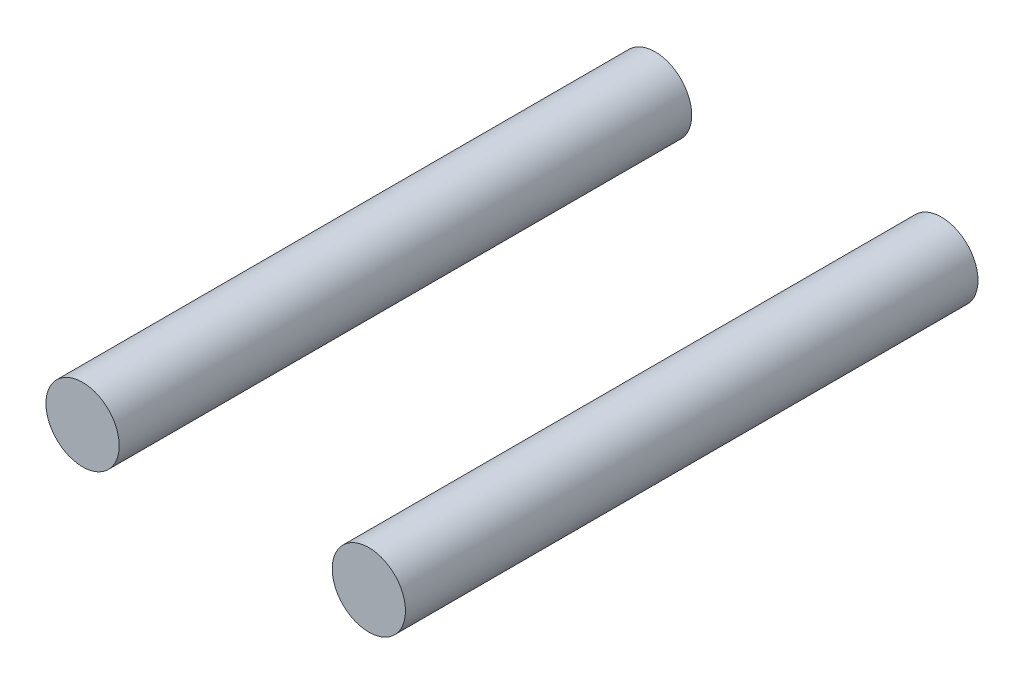
ISO-10303-21;
HEADER;
FILE_DESCRIPTION(('STEP AP214'),'2;1');
FILE_NAME('part.step','',(''),(''),'','','');
FILE_SCHEMA(('AUTOMOTIVE_DESIGN { 1 0 10303 214 1 1 1 1 }'));
ENDSEC;
DATA;
#1=APPLICATION_CONTEXT('core data for automotive mechanical design processes');
#2=APPLICATION_PROTOCOL_DEFINITION('international standard','automotive_design',2000,#1);
#3=PRODUCT_CONTEXT('',#1,'mechanical');
#4=PRODUCT('Part','Part','',(#3));
#5=PRODUCT_RELATED_PRODUCT_CATEGORY('part','',(#4));
#6=PRODUCT_DEFINITION_FORMATION('','',#4);
#7=PRODUCT_DEFINITION_CONTEXT('part definition',#1,'design');
#8=PRODUCT_DEFINITION('design','',#6,#7);
#9=PRODUCT_DEFINITION_SHAPE('','',#8);
#10=(LENGTH_UNIT() NAMED_UNIT(*) SI_UNIT(.MILLI.,.METRE.));
#11=(NAMED_UNIT(*) PLANE_ANGLE_UNIT() SI_UNIT($,.RADIAN.));
#12=(NAMED_UNIT(*) SI_UNIT($,.STERADIAN.) SOLID_ANGLE_UNIT());
#13=UNCERTAINTY_MEASURE_WITH_UNIT(LENGTH_MEASURE(1.E-05),#10,'distance_accuracy_value','');
#14=(GEOMETRIC_REPRESENTATION_CONTEXT(3) GLOBAL_UNCERTAINTY_ASSIGNED_CONTEXT((#13)) GLOBAL_UNIT_ASSIGNED_CONTEXT((#10,
#11,#12)) REPRESENTATION_CONTEXT('',''));
#15=CARTESIAN_POINT('',(0.,0.,0.));
#16=DIRECTION('',(0.,0.,1.));
#17=DIRECTION('',(1.,0.,0.));
#18=AXIS2_PLACEMENT_3D('',#15,#16,#17);
#19=CARTESIAN_POINT('',(1.25,0.,0.));
#20=DIRECTION('',(0.,0.,1.));
#21=DIRECTION('',(1.,0.,0.));
#22=AXIS2_PLACEMENT_3D('',#19,#20,#21);
#23=PLANE('',#22);
#24=CARTESIAN_POINT('',(1.25,0.,0.));
#25=DIRECTION('',(0.,0.,1.));
#26=DIRECTION('',(1.,0.,0.));
#27=AXIS2_PLACEMENT_3D('',#24,#25,#26);
#28=CIRCLE('',#27,0.32);
#29=CARTESIAN_POINT('',(1.57,0.,0.));
#30=VERTEX_POINT('',#29);
#31=EDGE_CURVE('P0_E18',#30,#30,#28,.F.);
#32=ORIENTED_EDGE('',*,*,#31,.F.);
#33=EDGE_LOOP('',(#32));
#34=FACE_BOUND('',#33,.T.);
#35=ADVANCED_FACE('P0_F15',(#34),#23,.T.);
#36=CARTESIAN_POINT('',(1.25,0.,-5.));
#37=DIRECTION('',(0.,0.,1.));
#38=DIRECTION('',(1.,0.,0.));
#39=AXIS2_PLACEMENT_3D('',#36,#37,#38);
#40=PLANE('',#39);
#41=CARTESIAN_POINT('',(1.25,0.,-5.));
#42=DIRECTION('',(0.,0.,1.));
#43=DIRECTION('',(1.,0.,0.));
#44=AXIS2_PLACEMENT_3D('',#41,#42,#43);
#45=CIRCLE('',#44,0.32);
#46=CARTESIAN_POINT('',(1.57,0.,-5.));
#47=VERTEX_POINT('',#46);
#48=EDGE_CURVE('P0_E10',#47,#47,#45,.T.);
#49=ORIENTED_EDGE('',*,*,#48,.F.);
#50=EDGE_LOOP('',(#49));
#51=FACE_BOUND('',#50,.T.);
#52=ADVANCED_FACE('P0_F30',(#51),#40,.F.);
#53=CARTESIAN_POINT('',(1.25,0.,-5.));
#54=DIRECTION('',(0.,0.,1.));
#55=DIRECTION('',(1.,0.,0.));
#56=AXIS2_PLACEMENT_3D('',#53,#54,#55);
#57=CYLINDRICAL_SURFACE('',#56,0.32);
#58=ORIENTED_EDGE('',*,*,#48,.T.);
#59=EDGE_LOOP('',(#58));
#60=FACE_BOUND('',#59,.T.);
#61=ORIENTED_EDGE('',*,*,#31,.T.);
#62=EDGE_LOOP('',(#61));
#63=FACE_BOUND('',#62,.T.);
#64=ADVANCED_FACE('P0_F27',(#60,#63),#57,.T.);
#65=CLOSED_SHELL('',(#35,#52,#64));
#66=MANIFOLD_SOLID_BREP('P0_B1',#65);
#67=CARTESIAN_POINT('',(-1.25,0.,0.));
#68=DIRECTION('',(0.,0.,1.));
#69=DIRECTION('',(1.,0.,0.));
#70=AXIS2_PLACEMENT_3D('',#67,#68,#69);
#71=PLANE('',#70);
#72=CARTESIAN_POINT('',(-1.25,0.,0.));
#73=DIRECTION('',(0.,0.,1.));
#74=DIRECTION('',(1.,0.,0.));
#75=AXIS2_PLACEMENT_3D('',#72,#73,#74);
#76=CIRCLE('',#75,0.32);
#77=CARTESIAN_POINT('',(-0.93,0.,0.));
#78=VERTEX_POINT('',#77);
#79=EDGE_CURVE('P1_E18',#78,#78,#76,.F.);
#80=ORIENTED_EDGE('',*,*,#79,.F.);
#81=EDGE_LOOP('',(#80));
#82=FACE_BOUND('',#81,.T.);
#83=ADVANCED_FACE('P1_F15',(#82),#71,.T.);
#84=CARTESIAN_POINT('',(-1.25,0.,-5.));
#85=DIRECTION('',(0.,0.,1.));
#86=DIRECTION('',(1.,0.,0.));
#87=AXIS2_PLACEMENT_3D('',#84,#85,#86);
#88=PLANE('',#87);
#89=CARTESIAN_POINT('',(-1.25,0.,-5.));
#90=DIRECTION('',(0.,0.,1.));
#91=DIRECTION('',(1.,0.,0.));
#92=AXIS2_PLACEMENT_3D('',#89,#90,#91);
#93=CIRCLE('',#92,0.32);
#94=CARTESIAN_POINT('',(-0.93,0.,-5.));
#95=VERTEX_POINT('',#94);
#96=EDGE_CURVE('P1_E10',#95,#95,#93,.T.);
#97=ORIENTED_EDGE('',*,*,#96,.F.);
#98=EDGE_LOOP('',(#97));
#99=FACE_BOUND('',#98,.T.);
#100=ADVANCED_FACE('P1_F30',(#99),#88,.F.);
#101=CARTESIAN_POINT('',(-1.25,0.,-5.));
#102=DIRECTION('',(0.,0.,1.));
#103=DIRECTION('',(1.,0.,0.));
#104=AXIS2_PLACEMENT_3D('',#101,#102,#103);
#105=CYLINDRICAL_SURFACE('',#104,0.32);
#106=ORIENTED_EDGE('',*,*,#96,.T.);
#107=EDGE_LOOP('',(#106));
#108=FACE_BOUND('',#107,.T.);
#109=ORIENTED_EDGE('',*,*,#79,.T.);
#110=EDGE_LOOP('',(#109));
#111=FACE_BOUND('',#110,.T.);
#112=ADVANCED_FACE('P1_F27',(#108,#111),#105,.T.);
#113=CLOSED_SHELL('',(#83,#100,#112));
#114=MANIFOLD_SOLID_BREP('P1_B1',#113);
#115=ADVANCED_BREP_SHAPE_REPRESENTATION('',(#18,#66,#114),#14);
#116=SHAPE_DEFINITION_REPRESENTATION(#9,#115);
ENDSEC;
END-ISO-10303-21;
